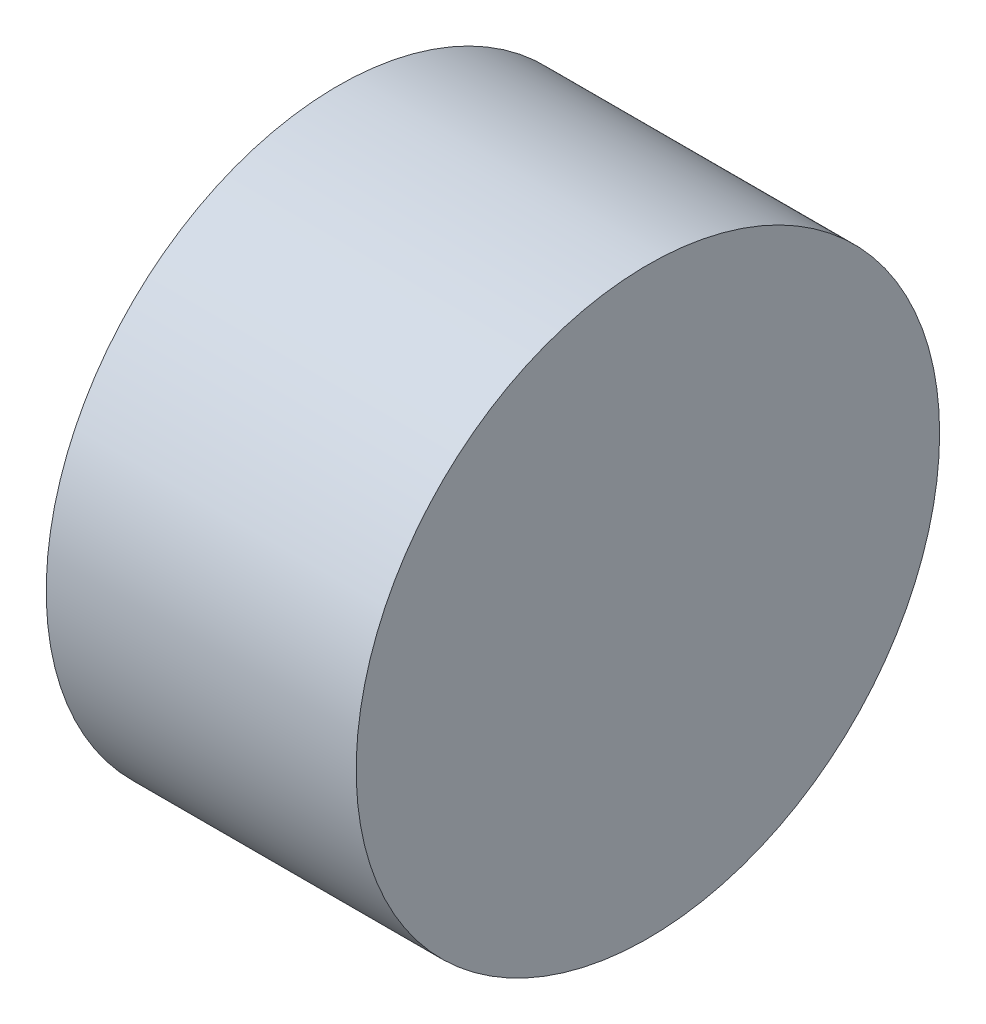
ISO-10303-21;
HEADER;
FILE_DESCRIPTION(('STEP AP214'),'2;1');
FILE_NAME('part.step','',(''),(''),'','','');
FILE_SCHEMA(('AUTOMOTIVE_DESIGN { 1 0 10303 214 1 1 1 1 }'));
ENDSEC;
DATA;
#1=APPLICATION_CONTEXT('core data for automotive mechanical design processes');
#2=APPLICATION_PROTOCOL_DEFINITION('international standard','automotive_design',2000,#1);
#3=PRODUCT_CONTEXT('',#1,'mechanical');
#4=PRODUCT('Part','Part','',(#3));
#5=PRODUCT_RELATED_PRODUCT_CATEGORY('part','',(#4));
#6=PRODUCT_DEFINITION_FORMATION('','',#4);
#7=PRODUCT_DEFINITION_CONTEXT('part definition',#1,'design');
#8=PRODUCT_DEFINITION('design','',#6,#7);
#9=PRODUCT_DEFINITION_SHAPE('','',#8);
#10=(LENGTH_UNIT() NAMED_UNIT(*) SI_UNIT(.MILLI.,.METRE.));
#11=(NAMED_UNIT(*) PLANE_ANGLE_UNIT() SI_UNIT($,.RADIAN.));
#12=(NAMED_UNIT(*) SI_UNIT($,.STERADIAN.) SOLID_ANGLE_UNIT());
#13=UNCERTAINTY_MEASURE_WITH_UNIT(LENGTH_MEASURE(1.E-05),#10,'distance_accuracy_value','');
#14=(GEOMETRIC_REPRESENTATION_CONTEXT(3) GLOBAL_UNCERTAINTY_ASSIGNED_CONTEXT((#13)) GLOBAL_UNIT_ASSIGNED_CONTEXT((#10,
#11,#12)) REPRESENTATION_CONTEXT('',''));
#15=CARTESIAN_POINT('',(0.,0.,0.));
#16=DIRECTION('',(0.,0.,1.));
#17=DIRECTION('',(1.,0.,0.));
#18=AXIS2_PLACEMENT_3D('',#15,#16,#17);
#19=CARTESIAN_POINT('',(0.,0.,0.));
#20=DIRECTION('',(1.,0.,0.));
#21=DIRECTION('',(0.,0.,-1.));
#22=AXIS2_PLACEMENT_3D('',#19,#20,#21);
#23=PLANE('',#22);
#24=CARTESIAN_POINT('',(0.,0.,0.));
#25=DIRECTION('',(1.,0.,0.));
#26=DIRECTION('',(0.,0.,-1.));
#27=AXIS2_PLACEMENT_3D('',#24,#25,#26);
#28=CIRCLE('',#27,16.);
#29=CARTESIAN_POINT('',(0.,0.,-16.));
#30=VERTEX_POINT('',#29);
#31=EDGE_CURVE('E10',#30,#30,#28,.T.);
#32=ORIENTED_EDGE('',*,*,#31,.T.);
#33=EDGE_LOOP('',(#32));
#34=FACE_BOUND('',#33,.T.);
#35=ADVANCED_FACE('F31',(#34),#23,.T.);
#36=CARTESIAN_POINT('',(0.,0.,0.));
#37=DIRECTION('',(1.,0.,0.));
#38=DIRECTION('',(0.,0.,-1.));
#39=AXIS2_PLACEMENT_3D('',#36,#37,#38);
#40=CYLINDRICAL_SURFACE('',#39,16.);
#41=CARTESIAN_POINT('',(-17.,0.,0.));
#42=DIRECTION('',(1.,0.,0.));
#43=DIRECTION('',(0.,0.,-1.));
#44=AXIS2_PLACEMENT_3D('',#41,#42,#43);
#45=CIRCLE('',#44,16.);
#46=CARTESIAN_POINT('',(-17.,0.,-16.));
#47=VERTEX_POINT('',#46);
#48=EDGE_CURVE('E37',#47,#47,#45,.T.);
#49=ORIENTED_EDGE('',*,*,#48,.T.);
#50=EDGE_LOOP('',(#49));
#51=FACE_BOUND('',#50,.T.);
#52=ORIENTED_EDGE('',*,*,#31,.F.);
#53=EDGE_LOOP('',(#52));
#54=FACE_BOUND('',#53,.T.);
#55=ADVANCED_FACE('F75',(#51,#54),#40,.T.);
#56=CARTESIAN_POINT('',(-17.,16.,0.));
#57=DIRECTION('',(-1.,0.,0.));
#58=DIRECTION('',(0.,0.,1.));
#59=AXIS2_PLACEMENT_3D('',#56,#57,#58);
#60=PLANE('',#59);
#61=CARTESIAN_POINT('',(-17.,0.,0.));
#62=DIRECTION('',(1.,0.,0.));
#63=DIRECTION('',(0.,0.,-1.));
#64=AXIS2_PLACEMENT_3D('',#61,#62,#63);
#65=CIRCLE('',#64,11.);
#66=CARTESIAN_POINT('',(-17.,0.,-11.));
#67=VERTEX_POINT('',#66);
#68=EDGE_CURVE('E41',#67,#67,#65,.T.);
#69=ORIENTED_EDGE('',*,*,#68,.T.);
#70=EDGE_LOOP('',(#69));
#71=FACE_BOUND('',#70,.T.);
#72=ORIENTED_EDGE('',*,*,#48,.F.);
#73=EDGE_LOOP('',(#72));
#74=FACE_BOUND('',#73,.T.);
#75=ADVANCED_FACE('F79',(#71,#74),#60,.T.);
#76=CARTESIAN_POINT('',(0.,0.,0.));
#77=DIRECTION('',(1.,0.,0.));
#78=DIRECTION('',(0.,0.,-1.));
#79=AXIS2_PLACEMENT_3D('',#76,#77,#78);
#80=CYLINDRICAL_SURFACE('',#79,11.);
#81=CARTESIAN_POINT('',(-3.,0.,0.));
#82=DIRECTION('',(1.,0.,0.));
#83=DIRECTION('',(0.,0.,-1.));
#84=AXIS2_PLACEMENT_3D('',#81,#82,#83);
#85=CIRCLE('',#84,11.);
#86=CARTESIAN_POINT('',(-3.,0.,-11.));
#87=VERTEX_POINT('',#86);
#88=EDGE_CURVE('E45',#87,#87,#85,.T.);
#89=ORIENTED_EDGE('',*,*,#88,.T.);
#90=EDGE_LOOP('',(#89));
#91=FACE_BOUND('',#90,.T.);
#92=ORIENTED_EDGE('',*,*,#68,.F.);
#93=EDGE_LOOP('',(#92));
#94=FACE_BOUND('',#93,.T.);
#95=ADVANCED_FACE('F83',(#91,#94),#80,.F.);
#96=CARTESIAN_POINT('',(-3.,11.,0.));
#97=DIRECTION('',(-1.,0.,0.));
#98=DIRECTION('',(0.,0.,1.));
#99=AXIS2_PLACEMENT_3D('',#96,#97,#98);
#100=PLANE('',#99);
#101=CARTESIAN_POINT('',(-3.,0.,0.));
#102=DIRECTION('',(1.,0.,0.));
#103=DIRECTION('',(0.,0.,-1.));
#104=AXIS2_PLACEMENT_3D('',#101,#102,#103);
#105=CIRCLE('',#104,5.);
#106=CARTESIAN_POINT('',(-3.,0.,-5.));
#107=VERTEX_POINT('',#106);
#108=EDGE_CURVE('E50',#107,#107,#105,.T.);
#109=ORIENTED_EDGE('',*,*,#108,.T.);
#110=EDGE_LOOP('',(#109));
#111=FACE_BOUND('',#110,.T.);
#112=ORIENTED_EDGE('',*,*,#88,.F.);
#113=EDGE_LOOP('',(#112));
#114=FACE_BOUND('',#113,.T.);
#115=ADVANCED_FACE('F90',(#111,#114),#100,.T.);
#116=CARTESIAN_POINT('',(0.,0.,0.));
#117=DIRECTION('',(1.,0.,0.));
#118=DIRECTION('',(0.,0.,-1.));
#119=AXIS2_PLACEMENT_3D('',#116,#117,#118);
#120=CYLINDRICAL_SURFACE('',#119,5.);
#121=CARTESIAN_POINT('',(-12.,0.,0.));
#122=DIRECTION('',(1.,0.,0.));
#123=DIRECTION('',(0.,0.,-1.));
#124=AXIS2_PLACEMENT_3D('',#121,#122,#123);
#125=CIRCLE('',#124,5.);
#126=CARTESIAN_POINT('',(-12.,0.,-5.));
#127=VERTEX_POINT('',#126);
#128=EDGE_CURVE('E53',#127,#127,#125,.T.);
#129=ORIENTED_EDGE('',*,*,#128,.T.);
#130=EDGE_LOOP('',(#129));
#131=FACE_BOUND('',#130,.T.);
#132=ORIENTED_EDGE('',*,*,#108,.F.);
#133=EDGE_LOOP('',(#132));
#134=FACE_BOUND('',#133,.T.);
#135=ADVANCED_FACE('F94',(#131,#134),#120,.T.);
#136=CARTESIAN_POINT('',(-12.,5.,0.));
#137=DIRECTION('',(-1.,0.,0.));
#138=DIRECTION('',(0.,0.,1.));
#139=AXIS2_PLACEMENT_3D('',#136,#137,#138);
#140=PLANE('',#139);
#141=CARTESIAN_POINT('',(-12.,0.,0.));
#142=DIRECTION('',(1.,0.,0.));
#143=DIRECTION('',(0.,0.,-1.));
#144=AXIS2_PLACEMENT_3D('',#141,#142,#143);
#145=CIRCLE('',#144,2.);
#146=CARTESIAN_POINT('',(-12.,0.,-2.));
#147=VERTEX_POINT('',#146);
#148=EDGE_CURVE('E56',#147,#147,#145,.T.);
#149=ORIENTED_EDGE('',*,*,#148,.T.);
#150=EDGE_LOOP('',(#149));
#151=FACE_BOUND('',#150,.T.);
#152=ORIENTED_EDGE('',*,*,#128,.F.);
#153=EDGE_LOOP('',(#152));
#154=FACE_BOUND('',#153,.T.);
#155=ADVANCED_FACE('F72',(#151,#154),#140,.T.);
#156=CARTESIAN_POINT('',(0.,0.,0.));
#157=DIRECTION('',(1.,0.,0.));
#158=DIRECTION('',(0.,0.,-1.));
#159=AXIS2_PLACEMENT_3D('',#156,#157,#158);
#160=CYLINDRICAL_SURFACE('',#159,2.);
#161=CARTESIAN_POINT('',(-3.,0.,0.));
#162=DIRECTION('',(1.,0.,0.));
#163=DIRECTION('',(0.,0.,-1.));
#164=AXIS2_PLACEMENT_3D('',#161,#162,#163);
#165=CIRCLE('',#164,2.);
#166=CARTESIAN_POINT('',(-3.,0.,-2.));
#167=VERTEX_POINT('',#166);
#168=EDGE_CURVE('E59',#167,#167,#165,.T.);
#169=ORIENTED_EDGE('',*,*,#168,.T.);
#170=EDGE_LOOP('',(#169));
#171=FACE_BOUND('',#170,.T.);
#172=ORIENTED_EDGE('',*,*,#148,.F.);
#173=EDGE_LOOP('',(#172));
#174=FACE_BOUND('',#173,.T.);
#175=ADVANCED_FACE('F63',(#171,#174),#160,.F.);
#176=CARTESIAN_POINT('',(-3.,2.,0.));
#177=DIRECTION('',(-1.,0.,0.));
#178=DIRECTION('',(0.,0.,1.));
#179=AXIS2_PLACEMENT_3D('',#176,#177,#178);
#180=PLANE('',#179);
#181=ORIENTED_EDGE('',*,*,#168,.F.);
#182=EDGE_LOOP('',(#181));
#183=FACE_BOUND('',#182,.T.);
#184=ADVANCED_FACE('F66',(#183),#180,.T.);
#185=CLOSED_SHELL('',(#35,#55,#75,#95,#115,#135,#155,#175,#184));
#186=MANIFOLD_SOLID_BREP('B2',#185);
#187=ADVANCED_BREP_SHAPE_REPRESENTATION('',(#18,#186),#14);
#188=SHAPE_DEFINITION_REPRESENTATION(#9,#187);
ENDSEC;
END-ISO-10303-21;
